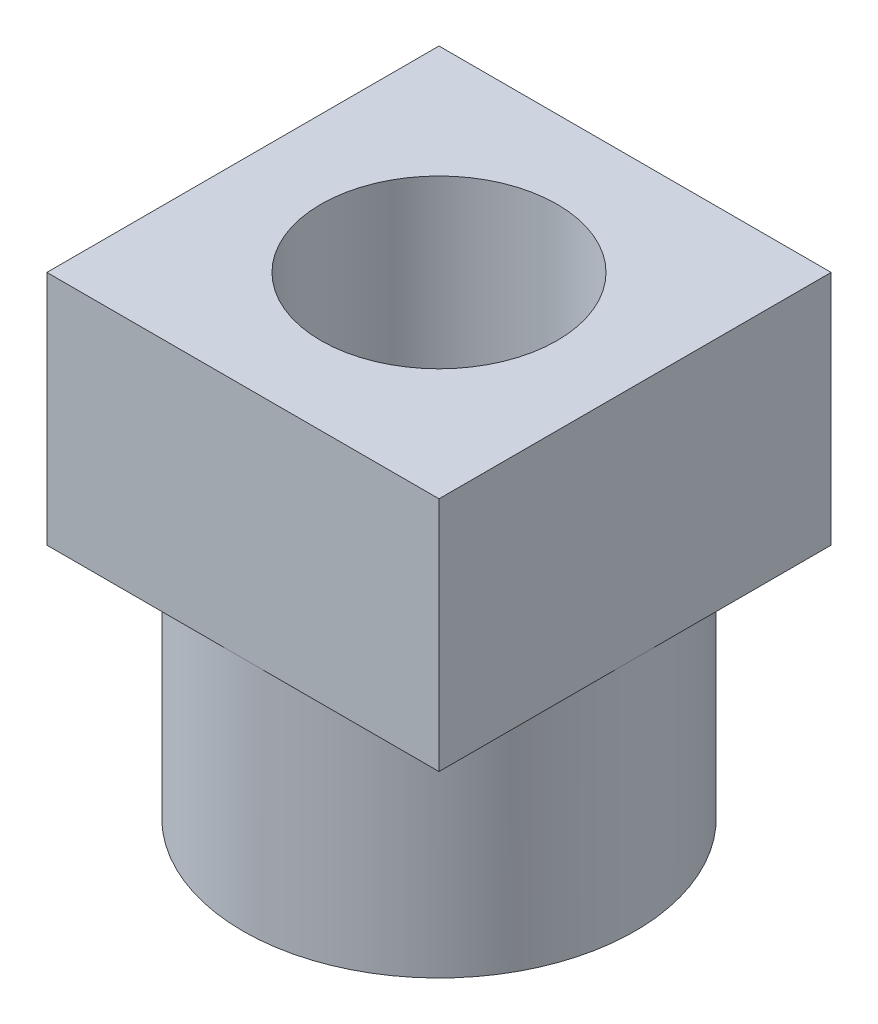
ISO-10303-21;
HEADER;
FILE_DESCRIPTION(('STEP AP214'),'2;1');
FILE_NAME('part.step','',(''),(''),'','','');
FILE_SCHEMA(('AUTOMOTIVE_DESIGN { 1 0 10303 214 1 1 1 1 }'));
ENDSEC;
DATA;
#1=APPLICATION_CONTEXT('core data for automotive mechanical design processes');
#2=APPLICATION_PROTOCOL_DEFINITION('international standard','automotive_design',2000,#1);
#3=PRODUCT_CONTEXT('',#1,'mechanical');
#4=PRODUCT('Part','Part','',(#3));
#5=PRODUCT_RELATED_PRODUCT_CATEGORY('part','',(#4));
#6=PRODUCT_DEFINITION_FORMATION('','',#4);
#7=PRODUCT_DEFINITION_CONTEXT('part definition',#1,'design');
#8=PRODUCT_DEFINITION('design','',#6,#7);
#9=PRODUCT_DEFINITION_SHAPE('','',#8);
#10=(LENGTH_UNIT() NAMED_UNIT(*) SI_UNIT(.MILLI.,.METRE.));
#11=(NAMED_UNIT(*) PLANE_ANGLE_UNIT() SI_UNIT($,.RADIAN.));
#12=(NAMED_UNIT(*) SI_UNIT($,.STERADIAN.) SOLID_ANGLE_UNIT());
#13=UNCERTAINTY_MEASURE_WITH_UNIT(LENGTH_MEASURE(1.E-05),#10,'distance_accuracy_value','');
#14=(GEOMETRIC_REPRESENTATION_CONTEXT(3) GLOBAL_UNCERTAINTY_ASSIGNED_CONTEXT((#13)) GLOBAL_UNIT_ASSIGNED_CONTEXT((#10,
#11,#12)) REPRESENTATION_CONTEXT('',''));
#15=CARTESIAN_POINT('',(0.,0.,0.));
#16=DIRECTION('',(0.,0.,1.));
#17=DIRECTION('',(1.,0.,0.));
#18=AXIS2_PLACEMENT_3D('',#15,#16,#17);
#19=CARTESIAN_POINT('',(0.,0.,0.));
#20=DIRECTION('',(0.,1.,0.));
#21=DIRECTION('',(0.,0.,1.));
#22=AXIS2_PLACEMENT_3D('',#19,#20,#21);
#23=PLANE('',#22);
#24=CARTESIAN_POINT('',(0.,0.,0.));
#25=DIRECTION('',(0.,-1.,0.));
#26=DIRECTION('',(0.,0.,-1.));
#27=AXIS2_PLACEMENT_3D('',#24,#25,#26);
#28=CIRCLE('',#27,8.3);
#29=CARTESIAN_POINT('',(0.,0.,-8.3));
#30=VERTEX_POINT('',#29);
#31=CARTESIAN_POINT('',(8.3,0.,0.));
#32=VERTEX_POINT('',#31);
#33=EDGE_CURVE('E46',#30,#32,#28,.T.);
#34=ORIENTED_EDGE('',*,*,#33,.F.);
#35=DIRECTION('',(1.,0.,0.));
#36=VECTOR('',#35,1.);
#37=CARTESIAN_POINT('',(-8.3,0.,-8.3));
#38=LINE('',#37,#36);
#39=CARTESIAN_POINT('',(8.3,0.,-8.3));
#40=VERTEX_POINT('',#39);
#41=EDGE_CURVE('E95',#30,#40,#38,.T.);
#42=ORIENTED_EDGE('',*,*,#41,.T.);
#43=DIRECTION('',(0.,0.,-1.));
#44=VECTOR('',#43,1.);
#45=CARTESIAN_POINT('',(8.3,0.,8.3));
#46=LINE('',#45,#44);
#47=EDGE_CURVE('E107',#32,#40,#46,.T.);
#48=ORIENTED_EDGE('',*,*,#47,.F.);
#49=EDGE_LOOP('',(#34,#42,#48));
#50=FACE_BOUND('',#49,.T.);
#51=ADVANCED_FACE('F35',(#50),#23,.F.);
#52=CARTESIAN_POINT('',(0.,0.,8.3));
#53=VERTEX_POINT('',#52);
#54=EDGE_CURVE('E11',#32,#53,#28,.T.);
#55=ORIENTED_EDGE('',*,*,#54,.F.);
#56=CARTESIAN_POINT('',(8.3,0.,8.3));
#57=VERTEX_POINT('',#56);
#58=EDGE_CURVE('E105',#57,#32,#46,.T.);
#59=ORIENTED_EDGE('',*,*,#58,.F.);
#60=DIRECTION('',(1.,0.,0.));
#61=VECTOR('',#60,1.);
#62=CARTESIAN_POINT('',(-8.3,0.,8.3));
#63=LINE('',#62,#61);
#64=EDGE_CURVE('E121',#53,#57,#63,.T.);
#65=ORIENTED_EDGE('',*,*,#64,.F.);
#66=EDGE_LOOP('',(#55,#59,#65));
#67=FACE_BOUND('',#66,.T.);
#68=ADVANCED_FACE('F156',(#67),#23,.F.);
#69=CARTESIAN_POINT('',(-8.3,0.,0.));
#70=VERTEX_POINT('',#69);
#71=EDGE_CURVE('E44',#53,#70,#28,.T.);
#72=ORIENTED_EDGE('',*,*,#71,.F.);
#73=CARTESIAN_POINT('',(-8.3,0.,8.3));
#74=VERTEX_POINT('',#73);
#75=EDGE_CURVE('E137',#74,#53,#63,.T.);
#76=ORIENTED_EDGE('',*,*,#75,.F.);
#77=DIRECTION('',(0.,0.,-1.));
#78=VECTOR('',#77,1.);
#79=CARTESIAN_POINT('',(-8.3,0.,8.3));
#80=LINE('',#79,#78);
#81=EDGE_CURVE('E129',#74,#70,#80,.T.);
#82=ORIENTED_EDGE('',*,*,#81,.T.);
#83=EDGE_LOOP('',(#72,#76,#82));
#84=FACE_BOUND('',#83,.T.);
#85=ADVANCED_FACE('F160',(#84),#23,.F.);
#86=CARTESIAN_POINT('',(-8.3,10.,8.3));
#87=DIRECTION('',(0.,0.,-1.));
#88=DIRECTION('',(-1.,0.,0.));
#89=AXIS2_PLACEMENT_3D('',#86,#87,#88);
#90=PLANE('',#89);
#91=ORIENTED_EDGE('',*,*,#75,.T.);
#92=ORIENTED_EDGE('',*,*,#64,.T.);
#93=DIRECTION('',(0.,-1.,0.));
#94=VECTOR('',#93,1.);
#95=CARTESIAN_POINT('',(8.3,10.,8.3));
#96=LINE('',#95,#94);
#97=CARTESIAN_POINT('',(8.3,10.,8.3));
#98=VERTEX_POINT('',#97);
#99=EDGE_CURVE('E39',#98,#57,#96,.T.);
#100=ORIENTED_EDGE('',*,*,#99,.F.);
#101=DIRECTION('',(1.,0.,0.));
#102=VECTOR('',#101,1.);
#103=CARTESIAN_POINT('',(-8.3,10.,8.3));
#104=LINE('',#103,#102);
#105=CARTESIAN_POINT('',(-8.3,10.,8.3));
#106=VERTEX_POINT('',#105);
#107=EDGE_CURVE('E125',#106,#98,#104,.T.);
#108=ORIENTED_EDGE('',*,*,#107,.F.);
#109=DIRECTION('',(0.,-1.,0.));
#110=VECTOR('',#109,1.);
#111=CARTESIAN_POINT('',(-8.3,10.,8.3));
#112=LINE('',#111,#110);
#113=EDGE_CURVE('E136',#106,#74,#112,.T.);
#114=ORIENTED_EDGE('',*,*,#113,.T.);
#115=EDGE_LOOP('',(#91,#92,#100,#108,#114));
#116=FACE_BOUND('',#115,.T.);
#117=ADVANCED_FACE('F37',(#116),#90,.F.);
#118=CARTESIAN_POINT('',(8.3,10.,8.3));
#119=DIRECTION('',(-1.,0.,0.));
#120=DIRECTION('',(0.,0.,1.));
#121=AXIS2_PLACEMENT_3D('',#118,#119,#120);
#122=PLANE('',#121);
#123=ORIENTED_EDGE('',*,*,#58,.T.);
#124=ORIENTED_EDGE('',*,*,#47,.T.);
#125=DIRECTION('',(0.,-1.,0.));
#126=VECTOR('',#125,1.);
#127=CARTESIAN_POINT('',(8.3,10.,-8.3));
#128=LINE('',#127,#126);
#129=CARTESIAN_POINT('',(8.3,10.,-8.3));
#130=VERTEX_POINT('',#129);
#131=EDGE_CURVE('E103',#130,#40,#128,.T.);
#132=ORIENTED_EDGE('',*,*,#131,.F.);
#133=DIRECTION('',(0.,0.,-1.));
#134=VECTOR('',#133,1.);
#135=CARTESIAN_POINT('',(8.3,10.,8.3));
#136=LINE('',#135,#134);
#137=EDGE_CURVE('E128',#98,#130,#136,.T.);
#138=ORIENTED_EDGE('',*,*,#137,.F.);
#139=ORIENTED_EDGE('',*,*,#99,.T.);
#140=EDGE_LOOP('',(#123,#124,#132,#138,#139));
#141=FACE_BOUND('',#140,.T.);
#142=ADVANCED_FACE('F155',(#141),#122,.F.);
#143=CARTESIAN_POINT('',(-8.3,10.,-8.3));
#144=DIRECTION('',(0.,0.,-1.));
#145=DIRECTION('',(-1.,0.,0.));
#146=AXIS2_PLACEMENT_3D('',#143,#144,#145);
#147=PLANE('',#146);
#148=CARTESIAN_POINT('',(-8.3,0.,-8.3));
#149=VERTEX_POINT('',#148);
#150=EDGE_CURVE('E89',#149,#30,#38,.T.);
#151=ORIENTED_EDGE('',*,*,#150,.F.);
#152=DIRECTION('',(0.,-1.,0.));
#153=VECTOR('',#152,1.);
#154=CARTESIAN_POINT('',(-8.3,10.,-8.3));
#155=LINE('',#154,#153);
#156=CARTESIAN_POINT('',(-8.3,10.,-8.3));
#157=VERTEX_POINT('',#156);
#158=EDGE_CURVE('E144',#157,#149,#155,.T.);
#159=ORIENTED_EDGE('',*,*,#158,.F.);
#160=DIRECTION('',(1.,0.,0.));
#161=VECTOR('',#160,1.);
#162=CARTESIAN_POINT('',(-8.3,10.,-8.3));
#163=LINE('',#162,#161);
#164=EDGE_CURVE('E131',#157,#130,#163,.T.);
#165=ORIENTED_EDGE('',*,*,#164,.T.);
#166=ORIENTED_EDGE('',*,*,#131,.T.);
#167=ORIENTED_EDGE('',*,*,#41,.F.);
#168=EDGE_LOOP('',(#151,#159,#165,#166,#167));
#169=FACE_BOUND('',#168,.T.);
#170=ADVANCED_FACE('F100',(#169),#147,.T.);
#171=CARTESIAN_POINT('',(-8.3,10.,8.3));
#172=DIRECTION('',(-1.,0.,0.));
#173=DIRECTION('',(0.,0.,1.));
#174=AXIS2_PLACEMENT_3D('',#171,#172,#173);
#175=PLANE('',#174);
#176=ORIENTED_EDGE('',*,*,#81,.F.);
#177=ORIENTED_EDGE('',*,*,#113,.F.);
#178=DIRECTION('',(0.,0.,-1.));
#179=VECTOR('',#178,1.);
#180=CARTESIAN_POINT('',(-8.3,10.,8.3));
#181=LINE('',#180,#179);
#182=EDGE_CURVE('E133',#106,#157,#181,.T.);
#183=ORIENTED_EDGE('',*,*,#182,.T.);
#184=ORIENTED_EDGE('',*,*,#158,.T.);
#185=EDGE_CURVE('E92',#70,#149,#80,.T.);
#186=ORIENTED_EDGE('',*,*,#185,.F.);
#187=EDGE_LOOP('',(#176,#177,#183,#184,#186));
#188=FACE_BOUND('',#187,.T.);
#189=ADVANCED_FACE('F147',(#188),#175,.T.);
#190=CARTESIAN_POINT('',(0.,10.,0.));
#191=DIRECTION('',(0.,1.,0.));
#192=DIRECTION('',(0.,0.,1.));
#193=AXIS2_PLACEMENT_3D('',#190,#191,#192);
#194=PLANE('',#193);
#195=CARTESIAN_POINT('',(0.,10.,0.));
#196=DIRECTION('',(0.,-1.,0.));
#197=DIRECTION('',(0.,0.,-1.));
#198=AXIS2_PLACEMENT_3D('',#195,#196,#197);
#199=CIRCLE('',#198,5.);
#200=CARTESIAN_POINT('',(0.,10.,-5.));
#201=VERTEX_POINT('',#200);
#202=EDGE_CURVE('E118',#201,#201,#199,.T.);
#203=ORIENTED_EDGE('',*,*,#202,.T.);
#204=EDGE_LOOP('',(#203));
#205=FACE_BOUND('',#204,.T.);
#206=ORIENTED_EDGE('',*,*,#107,.T.);
#207=ORIENTED_EDGE('',*,*,#137,.T.);
#208=ORIENTED_EDGE('',*,*,#164,.F.);
#209=ORIENTED_EDGE('',*,*,#182,.F.);
#210=EDGE_LOOP('',(#206,#207,#208,#209));
#211=FACE_BOUND('',#210,.T.);
#212=ADVANCED_FACE('F151',(#205,#211),#194,.T.);
#213=EDGE_CURVE('E59',#70,#30,#28,.T.);
#214=ORIENTED_EDGE('',*,*,#213,.F.);
#215=ORIENTED_EDGE('',*,*,#185,.T.);
#216=ORIENTED_EDGE('',*,*,#150,.T.);
#217=EDGE_LOOP('',(#214,#215,#216));
#218=FACE_BOUND('',#217,.T.);
#219=ADVANCED_FACE('F91',(#218),#23,.F.);
#220=CARTESIAN_POINT('',(0.,10.,0.));
#221=DIRECTION('',(0.,-1.,0.));
#222=DIRECTION('',(0.,0.,-1.));
#223=AXIS2_PLACEMENT_3D('',#220,#221,#222);
#224=CYLINDRICAL_SURFACE('',#223,5.);
#225=ORIENTED_EDGE('',*,*,#202,.F.);
#226=EDGE_LOOP('',(#225));
#227=FACE_BOUND('',#226,.T.);
#228=CARTESIAN_POINT('',(0.,0.,0.));
#229=DIRECTION('',(0.,-1.,0.));
#230=DIRECTION('',(0.,0.,-1.));
#231=AXIS2_PLACEMENT_3D('',#228,#229,#230);
#232=CIRCLE('',#231,5.);
#233=CARTESIAN_POINT('',(0.,0.,-5.));
#234=VERTEX_POINT('',#233);
#235=EDGE_CURVE('E122',#234,#234,#232,.T.);
#236=ORIENTED_EDGE('',*,*,#235,.T.);
#237=EDGE_LOOP('',(#236));
#238=FACE_BOUND('',#237,.T.);
#239=ADVANCED_FACE('F170',(#227,#238),#224,.F.);
#240=CARTESIAN_POINT('',(0.,-10.,0.));
#241=DIRECTION('',(0.,-1.,0.));
#242=DIRECTION('',(0.,0.,-1.));
#243=AXIS2_PLACEMENT_3D('',#240,#241,#242);
#244=PLANE('',#243);
#245=CARTESIAN_POINT('',(0.,-10.,0.));
#246=DIRECTION('',(0.,-1.,0.));
#247=DIRECTION('',(0.,0.,-1.));
#248=AXIS2_PLACEMENT_3D('',#245,#246,#247);
#249=CIRCLE('',#248,8.3);
#250=CARTESIAN_POINT('',(0.,-10.,-8.3));
#251=VERTEX_POINT('',#250);
#252=EDGE_CURVE('E110',#251,#251,#249,.T.);
#253=ORIENTED_EDGE('',*,*,#252,.T.);
#254=EDGE_LOOP('',(#253));
#255=FACE_BOUND('',#254,.T.);
#256=CARTESIAN_POINT('',(0.,-10.,0.));
#257=DIRECTION('',(0.,-1.,0.));
#258=DIRECTION('',(0.,0.,-1.));
#259=AXIS2_PLACEMENT_3D('',#256,#257,#258);
#260=CIRCLE('',#259,2.5);
#261=CARTESIAN_POINT('',(0.,-10.,-2.5));
#262=VERTEX_POINT('',#261);
#263=EDGE_CURVE('E111',#262,#262,#260,.T.);
#264=ORIENTED_EDGE('',*,*,#263,.F.);
#265=EDGE_LOOP('',(#264));
#266=FACE_BOUND('',#265,.T.);
#267=ADVANCED_FACE('F193',(#255,#266),#244,.T.);
#268=CARTESIAN_POINT('',(0.,0.,0.));
#269=DIRECTION('',(0.,-1.,0.));
#270=DIRECTION('',(0.,0.,-1.));
#271=AXIS2_PLACEMENT_3D('',#268,#269,#270);
#272=PLANE('',#271);
#273=ORIENTED_EDGE('',*,*,#235,.F.);
#274=EDGE_LOOP('',(#273));
#275=FACE_BOUND('',#274,.T.);
#276=CARTESIAN_POINT('',(0.,0.,0.));
#277=DIRECTION('',(0.,-1.,0.));
#278=DIRECTION('',(0.,0.,-1.));
#279=AXIS2_PLACEMENT_3D('',#276,#277,#278);
#280=CIRCLE('',#279,2.5);
#281=CARTESIAN_POINT('',(0.,0.,-2.5));
#282=VERTEX_POINT('',#281);
#283=EDGE_CURVE('E246',#282,#282,#280,.T.);
#284=ORIENTED_EDGE('',*,*,#283,.T.);
#285=EDGE_LOOP('',(#284));
#286=FACE_BOUND('',#285,.T.);
#287=ADVANCED_FACE('F197',(#275,#286),#272,.F.);
#288=CARTESIAN_POINT('',(0.,-10.,0.));
#289=DIRECTION('',(0.,1.,0.));
#290=DIRECTION('',(0.,0.,1.));
#291=AXIS2_PLACEMENT_3D('',#288,#289,#290);
#292=CYLINDRICAL_SURFACE('',#291,8.3);
#293=ORIENTED_EDGE('',*,*,#252,.F.);
#294=EDGE_LOOP('',(#293));
#295=FACE_BOUND('',#294,.T.);
#296=ORIENTED_EDGE('',*,*,#33,.T.);
#297=ORIENTED_EDGE('',*,*,#54,.T.);
#298=ORIENTED_EDGE('',*,*,#71,.T.);
#299=ORIENTED_EDGE('',*,*,#213,.T.);
#300=EDGE_LOOP('',(#296,#297,#298,#299));
#301=FACE_BOUND('',#300,.T.);
#302=ADVANCED_FACE('F113',(#295,#301),#292,.T.);
#303=CARTESIAN_POINT('',(0.,-10.,0.));
#304=DIRECTION('',(0.,1.,0.));
#305=DIRECTION('',(0.,0.,1.));
#306=AXIS2_PLACEMENT_3D('',#303,#304,#305);
#307=CYLINDRICAL_SURFACE('',#306,2.5);
#308=ORIENTED_EDGE('',*,*,#263,.T.);
#309=EDGE_LOOP('',(#308));
#310=FACE_BOUND('',#309,.T.);
#311=ORIENTED_EDGE('',*,*,#283,.F.);
#312=EDGE_LOOP('',(#311));
#313=FACE_BOUND('',#312,.T.);
#314=ADVANCED_FACE('F211',(#310,#313),#307,.F.);
#315=CLOSED_SHELL('',(#51,#68,#85,#117,#142,#170,#189,#212,#219,#239,#267,#287,#302,#314));
#316=MANIFOLD_SOLID_BREP('B2',#315);
#317=ADVANCED_BREP_SHAPE_REPRESENTATION('',(#18,#316),#14);
#318=SHAPE_DEFINITION_REPRESENTATION(#9,#317);
ENDSEC;
END-ISO-10303-21;
